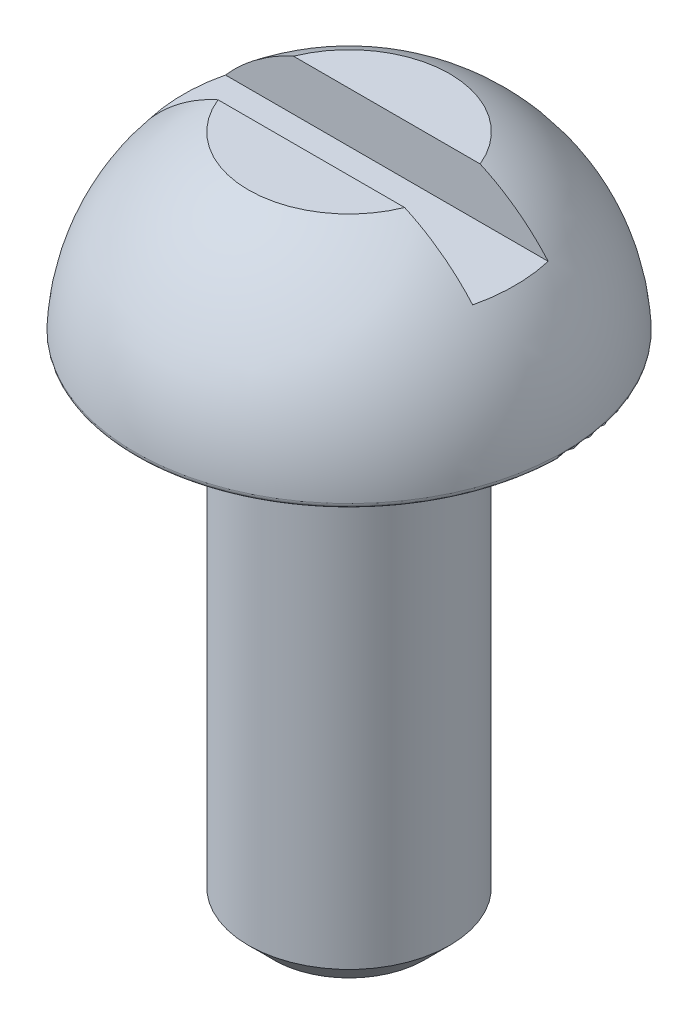
ISO-10303-21;
HEADER;
FILE_DESCRIPTION(('STEP AP214'),'2;1');
FILE_NAME('part.step','',(''),(''),'','','');
FILE_SCHEMA(('AUTOMOTIVE_DESIGN { 1 0 10303 214 1 1 1 1 }'));
ENDSEC;
DATA;
#1=APPLICATION_CONTEXT('core data for automotive mechanical design processes');
#2=APPLICATION_PROTOCOL_DEFINITION('international standard','automotive_design',2000,#1);
#3=PRODUCT_CONTEXT('',#1,'mechanical');
#4=PRODUCT('Part','Part','',(#3));
#5=PRODUCT_RELATED_PRODUCT_CATEGORY('part','',(#4));
#6=PRODUCT_DEFINITION_FORMATION('','',#4);
#7=PRODUCT_DEFINITION_CONTEXT('part definition',#1,'design');
#8=PRODUCT_DEFINITION('design','',#6,#7);
#9=PRODUCT_DEFINITION_SHAPE('','',#8);
#10=(LENGTH_UNIT() NAMED_UNIT(*) SI_UNIT(.MILLI.,.METRE.));
#11=(NAMED_UNIT(*) PLANE_ANGLE_UNIT() SI_UNIT($,.RADIAN.));
#12=(NAMED_UNIT(*) SI_UNIT($,.STERADIAN.) SOLID_ANGLE_UNIT());
#13=UNCERTAINTY_MEASURE_WITH_UNIT(LENGTH_MEASURE(1.E-05),#10,'distance_accuracy_value','');
#14=(GEOMETRIC_REPRESENTATION_CONTEXT(3) GLOBAL_UNCERTAINTY_ASSIGNED_CONTEXT((#13)) GLOBAL_UNIT_ASSIGNED_CONTEXT((#10,
#11,#12)) REPRESENTATION_CONTEXT('',''));
#15=CARTESIAN_POINT('',(0.,0.,0.));
#16=DIRECTION('',(0.,0.,1.));
#17=DIRECTION('',(1.,0.,0.));
#18=AXIS2_PLACEMENT_3D('',#15,#16,#17);
#19=CARTESIAN_POINT('',(0.,13.5,0.));
#20=DIRECTION('',(0.,1.,0.));
#21=DIRECTION('',(0.,0.,1.));
#22=AXIS2_PLACEMENT_3D('',#19,#20,#21);
#23=PLANE('',#22);
#24=DIRECTION('',(-1.,0.,0.));
#25=VECTOR('',#24,1.);
#26=CARTESIAN_POINT('',(-4.,13.5,-0.75));
#27=LINE('',#26,#25);
#28=CARTESIAN_POINT('',(1.85404962177392,13.5,-0.75));
#29=VERTEX_POINT('',#28);
#30=CARTESIAN_POINT('',(-1.85404962177392,13.5,-0.75));
#31=VERTEX_POINT('',#30);
#32=EDGE_CURVE('E83',#29,#31,#27,.T.);
#33=ORIENTED_EDGE('',*,*,#32,.F.);
#34=CARTESIAN_POINT('',(0.,13.5,0.));
#35=DIRECTION('',(0.,-1.,0.));
#36=DIRECTION('',(0.,0.,-1.));
#37=AXIS2_PLACEMENT_3D('',#34,#35,#36);
#38=CIRCLE('',#37,2.);
#39=EDGE_CURVE('E90',#31,#29,#38,.T.);
#40=ORIENTED_EDGE('',*,*,#39,.F.);
#41=EDGE_LOOP('',(#33,#40));
#42=FACE_BOUND('',#41,.T.);
#43=ADVANCED_FACE('F29',(#42),#23,.T.);
#44=CARTESIAN_POINT('',(1.5,0.,0.));
#45=DIRECTION('',(0.,-1.,0.));
#46=DIRECTION('',(0.,0.,-1.));
#47=AXIS2_PLACEMENT_3D('',#44,#45,#46);
#48=PLANE('',#47);
#49=CARTESIAN_POINT('',(0.,0.,0.));
#50=DIRECTION('',(0.,-1.,0.));
#51=DIRECTION('',(0.,0.,-1.));
#52=AXIS2_PLACEMENT_3D('',#49,#50,#51);
#53=CIRCLE('',#52,1.5);
#54=CARTESIAN_POINT('',(0.,0.,-1.5));
#55=VERTEX_POINT('',#54);
#56=EDGE_CURVE('E188',#55,#55,#53,.T.);
#57=ORIENTED_EDGE('',*,*,#56,.T.);
#58=EDGE_LOOP('',(#57));
#59=FACE_BOUND('',#58,.T.);
#60=ADVANCED_FACE('F31',(#59),#48,.T.);
#61=DIRECTION('',(1.,0.,0.));
#62=VECTOR('',#61,1.);
#63=CARTESIAN_POINT('',(-4.,13.5,0.750000000000001));
#64=LINE('',#63,#62);
#65=CARTESIAN_POINT('',(-1.85404962177392,13.5,0.75));
#66=VERTEX_POINT('',#65);
#67=CARTESIAN_POINT('',(1.85404962177392,13.5,0.75));
#68=VERTEX_POINT('',#67);
#69=EDGE_CURVE('E74',#66,#68,#64,.T.);
#70=ORIENTED_EDGE('',*,*,#69,.F.);
#71=EDGE_CURVE('E82',#68,#66,#38,.T.);
#72=ORIENTED_EDGE('',*,*,#71,.F.);
#73=EDGE_LOOP('',(#70,#72));
#74=FACE_BOUND('',#73,.T.);
#75=ADVANCED_FACE('F81',(#74),#23,.T.);
#76=CARTESIAN_POINT('',(0.,9.90254895572012,0.));
#77=DIRECTION('',(0.,-1.,0.));
#78=DIRECTION('',(0.,0.,-1.));
#79=AXIS2_PLACEMENT_3D('',#76,#77,#78);
#80=DEGENERATE_TOROIDAL_SURFACE('',#79,0.251187264453516,4.,.T.);
#81=CARTESIAN_POINT('',(0.,13.8713253231735,-0.75));
#82=CARTESIAN_POINT('',(-0.0629220390886012,13.8713254213378,-0.75));
#83=CARTESIAN_POINT('',(-0.125844467781649,13.8703374468603,-0.75));
#84=CARTESIAN_POINT('',(-0.251619483946908,13.8662956578809,-0.75));
#85=CARTESIAN_POINT('',(-0.314472072160981,13.8632418655369,-0.75));
#86=CARTESIAN_POINT('',(-0.502918858461382,13.8506387891646,-0.75));
#87=CARTESIAN_POINT('',(-0.628314596643319,13.8376472734626,-0.75));
#88=CARTESIAN_POINT('',(-0.869884431273301,13.8021927933833,-0.75));
#89=CARTESIAN_POINT('',(-0.986150684308808,13.7803627004585,-0.75));
#90=CARTESIAN_POINT('',(-1.21645990898877,13.7269196245079,-0.75));
#91=CARTESIAN_POINT('',(-1.33050229164678,13.6953040862557,-0.75));
#92=CARTESIAN_POINT('',(-1.55547287393435,13.6222320704912,-0.75));
#93=CARTESIAN_POINT('',(-1.6663990913075,13.5807694807947,-0.75));
#94=CARTESIAN_POINT('',(-1.88419647938333,13.4881868164881,-0.75));
#95=CARTESIAN_POINT('',(-1.99106618245551,13.4370632858373,-0.75));
#96=CARTESIAN_POINT('',(-2.19763665776107,13.3266772445949,-0.75));
#97=CARTESIAN_POINT('',(-2.29744086526932,13.2676082643384,-0.75));
#98=CARTESIAN_POINT('',(-2.49153541034022,13.1409398253045,-0.75));
#99=CARTESIAN_POINT('',(-2.58582359240153,13.0733370639324,-0.75));
#100=CARTESIAN_POINT('',(-2.7680690910925,12.9301403902095,-0.75));
#101=CARTESIAN_POINT('',(-2.85602908815232,12.8545498951203,-0.75));
#102=CARTESIAN_POINT('',(-3.02498268485799,12.695931842077,-0.75));
#103=CARTESIAN_POINT('',(-3.10597371602768,12.6129015649429,-0.75));
#104=CARTESIAN_POINT('',(-3.33143210845437,12.3603614140614,-0.75));
#105=CARTESIAN_POINT('',(-3.46574464429,12.1815688741806,-0.75));
#106=CARTESIAN_POINT('',(-3.70218252479334,11.8040090139898,-0.75));
#107=CARTESIAN_POINT('',(-3.80431386039929,11.6052454206421,-0.75));
#108=CARTESIAN_POINT('',(-3.97319355372104,11.1942557231494,-0.75));
#109=CARTESIAN_POINT('',(-4.0401021375461,10.9820955861659,-0.75));
#110=CARTESIAN_POINT('',(-4.13730574145651,10.5495442433007,-0.75));
#111=CARTESIAN_POINT('',(-4.16759935711677,10.3291527220255,-0.75));
#112=CARTESIAN_POINT('',(-4.19069515207767,9.88665882197309,-0.75));
#113=CARTESIAN_POINT('',(-4.18353898974582,9.66455861850789,-0.75));
#114=CARTESIAN_POINT('',(-4.13203662682793,9.22471647603451,-0.75));
#115=CARTESIAN_POINT('',(-4.08769068622574,9.00697450656997,-0.75));
#116=CARTESIAN_POINT('',(-3.96307377974643,8.58204274703518,-0.75));
#117=CARTESIAN_POINT('',(-3.88280649605122,8.37485187782938,-0.75));
#118=CARTESIAN_POINT('',(-3.68867736949314,7.97690766882909,-0.75));
#119=CARTESIAN_POINT('',(-3.57481747195615,7.78615337802955,-0.75));
#120=CARTESIAN_POINT('',(-3.31657081872274,7.42627346359334,-0.75));
#121=CARTESIAN_POINT('',(-3.17216904612608,7.25715854554567,-0.75));
#122=CARTESIAN_POINT('',(-2.93601924886324,7.02351332143022,-0.75));
#123=CARTESIAN_POINT('',(-2.85398221458269,6.94892545603554,-0.75));
#124=CARTESIAN_POINT('',(-2.68394810384282,6.80690184949098,-0.75));
#125=CARTESIAN_POINT('',(-2.59595319203265,6.73946353333475,-0.75));
#126=CARTESIAN_POINT('',(-2.41433368923245,6.61199276166022,-0.75));
#127=CARTESIAN_POINT('',(-2.32069166082742,6.55198519673803,-0.75));
#128=CARTESIAN_POINT('',(-2.12874390081305,6.44004320274453,-0.75));
#129=CARTESIAN_POINT('',(-2.0304398290893,6.38810592805728,-0.75));
#130=CARTESIAN_POINT('',(-1.82995802317233,6.2926537500461,-0.75));
#131=CARTESIAN_POINT('',(-1.72778462116709,6.24912974206796,-0.75));
#132=CARTESIAN_POINT('',(-1.52023329889945,6.17066887724191,-0.75));
#133=CARTESIAN_POINT('',(-1.41485641920221,6.13572926477363,-0.75));
#134=CARTESIAN_POINT('',(-1.2005465350259,6.0741975045066,-0.75));
#135=CARTESIAN_POINT('',(-1.09158838507219,6.04769309162907,-0.75));
#136=CARTESIAN_POINT('',(-0.87194324868985,6.00338521032545,-0.75));
#137=CARTESIAN_POINT('',(-0.76125644537532,5.98558082668133,-0.75));
#138=CARTESIAN_POINT('',(-0.538546587546819,5.95806859383276,-0.75));
#139=CARTESIAN_POINT('',(-0.426520440227823,5.94838619402209,-0.75));
#140=CARTESIAN_POINT('',(-0.258194158556273,5.93914793915042,-0.75));
#141=CARTESIAN_POINT('',(-0.202019189981141,5.93694955766882,-0.75));
#142=CARTESIAN_POINT('',(-0.0896292807192961,5.9341765918778,-0.75));
#143=CARTESIAN_POINT('',(-0.0334143413581222,5.93360195602258,-0.75));
#144=CARTESIAN_POINT('',(0.0895703381347306,5.93407056708453,-0.75));
#145=CARTESIAN_POINT('',(0.156339023293249,5.9354380251739,-0.75));
#146=CARTESIAN_POINT('',(0.289786823027111,5.94053883249711,-0.75));
#147=CARTESIAN_POINT('',(0.356465939241011,5.94427213784326,-0.75));
#148=CARTESIAN_POINT('',(0.489601645075184,5.95436469770027,-0.75));
#149=CARTESIAN_POINT('',(0.556058317748404,5.96072282720604,-0.75));
#150=CARTESIAN_POINT('',(0.688634384673021,5.97628855319762,-0.75));
#151=CARTESIAN_POINT('',(0.754753776904648,5.98549616672698,-0.75));
#152=CARTESIAN_POINT('',(0.951981100661976,6.01757626217259,-0.75));
#153=CARTESIAN_POINT('',(1.08239697789367,6.04493679870434,-0.75));
#154=CARTESIAN_POINT('',(1.33999759950547,6.11213097122829,-0.75));
#155=CARTESIAN_POINT('',(1.46718176548068,6.15196682326141,-0.75));
#156=CARTESIAN_POINT('',(1.71387869519374,6.24285666478502,-0.75));
#157=CARTESIAN_POINT('',(1.83350374454184,6.29360539741071,-0.75));
#158=CARTESIAN_POINT('',(2.06724369377024,6.4065047804184,-0.75));
#159=CARTESIAN_POINT('',(2.18135873591225,6.46865513622527,-0.75));
#160=CARTESIAN_POINT('',(2.40313784057959,6.60394177082253,-0.75));
#161=CARTESIAN_POINT('',(2.51079154052084,6.67709507024297,-0.75));
#162=CARTESIAN_POINT('',(2.71834946723273,6.83359515066767,-0.75));
#163=CARTESIAN_POINT('',(2.81825469564505,6.91694061053436,-0.75));
#164=CARTESIAN_POINT('',(3.07844234976517,7.1567818148287,-0.75));
#165=CARTESIAN_POINT('',(3.23025767468538,7.32265641437973,-0.75));
#166=CARTESIAN_POINT('',(3.5033601946328,7.67750241905313,-0.75));
#167=CARTESIAN_POINT('',(3.62467695528908,7.86645118969516,-0.750000000000001));
#168=CARTESIAN_POINT('',(3.83263269671526,8.26047409624548,-0.750000000000001));
#169=CARTESIAN_POINT('',(3.91956385703199,8.46539383941384,-0.750000000000001));
#170=CARTESIAN_POINT('',(4.0577395883791,8.88697054825718,-0.750000000000001));
#171=CARTESIAN_POINT('',(4.10897748310089,9.10362970158661,-0.750000000000001));
#172=CARTESIAN_POINT('',(4.17422265872735,9.54210881083407,-0.750000000000001));
#173=CARTESIAN_POINT('',(4.18829264552823,9.76391943692915,-0.750000000000001));
#174=CARTESIAN_POINT('',(4.17897916787922,10.2067483244606,-0.750000000000001));
#175=CARTESIAN_POINT('',(4.15559659045676,10.4277666045386,-0.750000000000001));
#176=CARTESIAN_POINT('',(4.07206283828415,10.8626708282922,-0.750000000000001));
#177=CARTESIAN_POINT('',(4.01192268581079,11.0765588897966,-0.750000000000001));
#178=CARTESIAN_POINT('',(3.85659607902625,11.4911991468696,-0.750000000000001));
#179=CARTESIAN_POINT('',(3.76141172880569,11.6919521302301,-0.750000000000001));
#180=CARTESIAN_POINT('',(3.53871279537206,12.0746900669347,-0.750000000000001));
#181=CARTESIAN_POINT('',(3.41118817548029,12.2566691691665,-0.75));
#182=CARTESIAN_POINT('',(3.12731814091474,12.5967721515395,-0.75));
#183=CARTESIAN_POINT('',(2.97096759896837,12.7548917786782,-0.750000000000001));
#184=CARTESIAN_POINT('',(2.71830594289221,12.97080228372,-0.75));
#185=CARTESIAN_POINT('',(2.6309277740663,13.0393084942463,-0.75));
#186=CARTESIAN_POINT('',(2.45074238373382,13.168745130094,-0.75));
#187=CARTESIAN_POINT('',(2.35793712481219,13.2296782694367,-0.75));
#188=CARTESIAN_POINT('',(2.1675677834584,13.343557218428,-0.75));
#189=CARTESIAN_POINT('',(2.07000403410402,13.3965035860641,-0.75));
#190=CARTESIAN_POINT('',(1.87084215744287,13.4940753895157,-0.75));
#191=CARTESIAN_POINT('',(1.76924542615833,13.5387036747013,-0.75));
#192=CARTESIAN_POINT('',(1.56195371290642,13.6197215068276,-0.75));
#193=CARTESIAN_POINT('',(1.45623396355732,13.6560476303505,-0.75));
#194=CARTESIAN_POINT('',(1.24221239842266,13.719915488697,-0.75));
#195=CARTESIAN_POINT('',(1.13391134592798,13.7474597865035,-0.75));
#196=CARTESIAN_POINT('',(0.915531306850148,13.7938641658016,-0.75));
#197=CARTESIAN_POINT('',(0.805453199909168,13.8127284152648,-0.75));
#198=CARTESIAN_POINT('',(0.584239227879711,13.8422672663623,-0.75));
#199=CARTESIAN_POINT('',(0.473103559335943,13.8529433607682,-0.75));
#200=CARTESIAN_POINT('',(0.301534200611887,13.8639021013191,-0.75));
#201=CARTESIAN_POINT('',(0.241243654966937,13.8667061035804,-0.75));
#202=CARTESIAN_POINT('',(0.12063550406229,13.870417155203,-0.75));
#203=CARTESIAN_POINT('',(0.060317931042758,13.8713252290718,-0.75));
#204=CARTESIAN_POINT('',(0.,13.8713253231735,-0.75));
#205=B_SPLINE_CURVE_WITH_KNOTS('',3,(#81,#82,#83,#84,#85,#86,#87,#88,#89,#90,#91,#92,#93,#94,
#95,#96,#97,#98,#99,#100,#101,#102,#103,#104,#105,#106,#107,#108,#109,#110,#111,#112,#113,#114,
#115,#116,#117,#118,#119,#120,#121,#122,#123,#124,#125,#126,#127,#128,#129,#130,#131,#132,#133,
#134,#135,#136,#137,#138,#139,#140,#141,#142,#143,#144,#145,#146,#147,#148,#149,#150,#151,#152,
#153,#154,#155,#156,#157,#158,#159,#160,#161,#162,#163,#164,#165,#166,#167,#168,#169,#170,#171,
#172,#173,#174,#175,#176,#177,#178,#179,#180,#181,#182,#183,#184,#185,#186,#187,#188,#189,#190,
#191,#192,#193,#194,#195,#196,#197,#198,#199,#200,#201,#202,#203,#204),.UNSPECIFIED.,.T.,.F.,(4,
2,2,2,2,2,2,2,2,2,2,2,2,2,2,2,2,2,2,2,2,2,2,2,2,2,2,2,2,2,2,2,2,2,2,2,2,2,2,2,2,2,2,2,2,2,2,2,2,
2,2,2,2,2,2,2,2,2,2,2,2,4),(0.,0.188756294687437,0.377510564821113,0.755280997491542,
1.10977622931115,1.46436410697405,1.81917265954468,2.174108380069,2.52158816349091,
2.86920283711227,3.21666939393033,3.56426346905097,4.23165319589308,4.89891860617539,
5.56312185026573,6.2273505701151,6.89084057267821,7.5543259369976,8.21774330512855,
8.88112226273996,9.54482815347266,9.87713428134949,10.20932031517,10.5425905787883,
10.875743062033,11.2085329713489,11.541215913981,11.8772538585757,12.2132564453317,
12.550307969775,12.7189437464545,12.8875741697316,13.0878831385615,13.2881883916656,
13.488407882506,13.688628570937,14.087755045107,14.4869524579857,14.876172775606,
15.2653830386506,15.6552016901302,16.0449698656331,16.7160597555839,17.3864965532814,
18.051107440301,18.7158426072585,19.3794555826048,20.0430528411576,20.7064512082832,
21.3698097507646,22.0333744165032,22.6970572246923,23.0298308802171,23.3624849310183,
23.6951157305166,24.0276323766348,24.3626101283001,24.6974900267561,25.0322089548769,
25.3668668463163,25.5479090789648,25.7288534560345),.UNSPECIFIED.);
#206=CARTESIAN_POINT('',(-3.20655950030948,12.5,-0.75));
#207=VERTEX_POINT('',#206);
#208=EDGE_CURVE('E11',#31,#207,#205,.T.);
#209=ORIENTED_EDGE('',*,*,#208,.F.);
#210=ORIENTED_EDGE('',*,*,#39,.T.);
#211=CARTESIAN_POINT('',(3.20655950030948,12.5,-0.75));
#212=VERTEX_POINT('',#211);
#213=EDGE_CURVE('E33',#212,#29,#205,.T.);
#214=ORIENTED_EDGE('',*,*,#213,.F.);
#215=CARTESIAN_POINT('',(0.,12.5,0.));
#216=DIRECTION('',(0.,1.,0.));
#217=DIRECTION('',(0.,0.,1.));
#218=AXIS2_PLACEMENT_3D('',#215,#216,#217);
#219=CIRCLE('',#218,3.29310246257613);
#220=CARTESIAN_POINT('',(3.20655950030948,12.5,0.75));
#221=VERTEX_POINT('',#220);
#222=EDGE_CURVE('E102',#212,#221,#219,.F.);
#223=ORIENTED_EDGE('',*,*,#222,.T.);
#224=CARTESIAN_POINT('',(0.,13.8713253231735,0.75));
#225=CARTESIAN_POINT('',(0.0629220390886012,13.8713254213378,0.75));
#226=CARTESIAN_POINT('',(0.125844467781649,13.8703374468603,0.75));
#227=CARTESIAN_POINT('',(0.251619483946908,13.8662956578809,0.75));
#228=CARTESIAN_POINT('',(0.314472072160981,13.8632418655369,0.75));
#229=CARTESIAN_POINT('',(0.502918858461382,13.8506387891646,0.75));
#230=CARTESIAN_POINT('',(0.628314596643319,13.8376472734626,0.75));
#231=CARTESIAN_POINT('',(0.869884431273301,13.8021927933833,0.75));
#232=CARTESIAN_POINT('',(0.986150684308808,13.7803627004585,0.75));
#233=CARTESIAN_POINT('',(1.21645990898877,13.7269196245079,0.75));
#234=CARTESIAN_POINT('',(1.33050229164678,13.6953040862557,0.75));
#235=CARTESIAN_POINT('',(1.55547287393435,13.6222320704912,0.75));
#236=CARTESIAN_POINT('',(1.6663990913075,13.5807694807947,0.75));
#237=CARTESIAN_POINT('',(1.88419647938333,13.4881868164881,0.75));
#238=CARTESIAN_POINT('',(1.99106618245551,13.4370632858373,0.75));
#239=CARTESIAN_POINT('',(2.19763665776107,13.3266772445949,0.75));
#240=CARTESIAN_POINT('',(2.29744086526932,13.2676082643384,0.75));
#241=CARTESIAN_POINT('',(2.49153541034022,13.1409398253045,0.75));
#242=CARTESIAN_POINT('',(2.58582359240153,13.0733370639324,0.75));
#243=CARTESIAN_POINT('',(2.7680690910925,12.9301403902095,0.75));
#244=CARTESIAN_POINT('',(2.85602908815232,12.8545498951203,0.75));
#245=CARTESIAN_POINT('',(3.02498268485799,12.695931842077,0.75));
#246=CARTESIAN_POINT('',(3.10597371602768,12.6129015649429,0.75));
#247=CARTESIAN_POINT('',(3.33143210845437,12.3603614140614,0.75));
#248=CARTESIAN_POINT('',(3.46574464429,12.1815688741806,0.75));
#249=CARTESIAN_POINT('',(3.70218252479334,11.8040090139898,0.75));
#250=CARTESIAN_POINT('',(3.80431386039929,11.6052454206421,0.749999999999999));
#251=CARTESIAN_POINT('',(3.97319355372104,11.1942557231494,0.749999999999999));
#252=CARTESIAN_POINT('',(4.0401021375461,10.9820955861659,0.749999999999999));
#253=CARTESIAN_POINT('',(4.13730574145651,10.5495442433007,0.749999999999999));
#254=CARTESIAN_POINT('',(4.16759935711677,10.3291527220255,0.749999999999999));
#255=CARTESIAN_POINT('',(4.19069515207767,9.88665882197309,0.749999999999999));
#256=CARTESIAN_POINT('',(4.18353898974582,9.66455861850789,0.749999999999999));
#257=CARTESIAN_POINT('',(4.13203662682793,9.22471647603451,0.749999999999999));
#258=CARTESIAN_POINT('',(4.08769068622574,9.00697450656997,0.749999999999999));
#259=CARTESIAN_POINT('',(3.96307377974643,8.58204274703518,0.749999999999999));
#260=CARTESIAN_POINT('',(3.88280649605122,8.37485187782938,0.749999999999999));
#261=CARTESIAN_POINT('',(3.68867736949314,7.97690766882909,0.749999999999999));
#262=CARTESIAN_POINT('',(3.57481747195615,7.78615337802955,0.75));
#263=CARTESIAN_POINT('',(3.31657081872274,7.42627346359334,0.75));
#264=CARTESIAN_POINT('',(3.17216904612608,7.25715854554567,0.749999999999999));
#265=CARTESIAN_POINT('',(2.93601924886324,7.02351332143022,0.75));
#266=CARTESIAN_POINT('',(2.85398221458269,6.94892545603554,0.75));
#267=CARTESIAN_POINT('',(2.68394810384282,6.80690184949098,0.75));
#268=CARTESIAN_POINT('',(2.59595319203265,6.73946353333475,0.75));
#269=CARTESIAN_POINT('',(2.41433368923245,6.61199276166022,0.75));
#270=CARTESIAN_POINT('',(2.32069166082742,6.55198519673803,0.75));
#271=CARTESIAN_POINT('',(2.12874390081305,6.44004320274453,0.75));
#272=CARTESIAN_POINT('',(2.0304398290893,6.38810592805728,0.75));
#273=CARTESIAN_POINT('',(1.82995802317233,6.2926537500461,0.75));
#274=CARTESIAN_POINT('',(1.72778462116709,6.24912974206796,0.75));
#275=CARTESIAN_POINT('',(1.52023329889945,6.17066887724191,0.75));
#276=CARTESIAN_POINT('',(1.41485641920221,6.13572926477363,0.75));
#277=CARTESIAN_POINT('',(1.2005465350259,6.0741975045066,0.75));
#278=CARTESIAN_POINT('',(1.09158838507219,6.04769309162907,0.75));
#279=CARTESIAN_POINT('',(0.87194324868985,6.00338521032545,0.75));
#280=CARTESIAN_POINT('',(0.76125644537532,5.98558082668133,0.75));
#281=CARTESIAN_POINT('',(0.538546587546819,5.95806859383276,0.75));
#282=CARTESIAN_POINT('',(0.426520440227823,5.94838619402209,0.75));
#283=CARTESIAN_POINT('',(0.258194158556273,5.93914793915042,0.75));
#284=CARTESIAN_POINT('',(0.202019189981141,5.93694955766882,0.75));
#285=CARTESIAN_POINT('',(0.0896292807192961,5.9341765918778,0.75));
#286=CARTESIAN_POINT('',(0.0334143413581222,5.93360195602258,0.75));
#287=CARTESIAN_POINT('',(-0.0895703381347306,5.93407056708453,0.75));
#288=CARTESIAN_POINT('',(-0.156339023293249,5.9354380251739,0.75));
#289=CARTESIAN_POINT('',(-0.289786823027111,5.94053883249711,0.75));
#290=CARTESIAN_POINT('',(-0.356465939241011,5.94427213784326,0.75));
#291=CARTESIAN_POINT('',(-0.489601645075184,5.95436469770027,0.75));
#292=CARTESIAN_POINT('',(-0.556058317748404,5.96072282720604,0.75));
#293=CARTESIAN_POINT('',(-0.688634384673021,5.97628855319762,0.75));
#294=CARTESIAN_POINT('',(-0.754753776904648,5.98549616672698,0.75));
#295=CARTESIAN_POINT('',(-0.951981100661976,6.01757626217259,0.75));
#296=CARTESIAN_POINT('',(-1.08239697789367,6.04493679870434,0.75));
#297=CARTESIAN_POINT('',(-1.33999759950547,6.11213097122829,0.75));
#298=CARTESIAN_POINT('',(-1.46718176548068,6.15196682326141,0.75));
#299=CARTESIAN_POINT('',(-1.71387869519374,6.24285666478502,0.75));
#300=CARTESIAN_POINT('',(-1.83350374454184,6.29360539741071,0.75));
#301=CARTESIAN_POINT('',(-2.06724369377024,6.4065047804184,0.75));
#302=CARTESIAN_POINT('',(-2.18135873591225,6.46865513622527,0.75));
#303=CARTESIAN_POINT('',(-2.40313784057959,6.60394177082253,0.75));
#304=CARTESIAN_POINT('',(-2.51079154052084,6.67709507024297,0.75));
#305=CARTESIAN_POINT('',(-2.71834946723273,6.83359515066767,0.75));
#306=CARTESIAN_POINT('',(-2.81825469564505,6.91694061053436,0.75));
#307=CARTESIAN_POINT('',(-3.07844234976517,7.1567818148287,0.75));
#308=CARTESIAN_POINT('',(-3.23025767468538,7.32265641437973,0.75));
#309=CARTESIAN_POINT('',(-3.5033601946328,7.67750241905313,0.75));
#310=CARTESIAN_POINT('',(-3.62467695528908,7.86645118969516,0.750000000000001));
#311=CARTESIAN_POINT('',(-3.83263269671526,8.26047409624548,0.750000000000001));
#312=CARTESIAN_POINT('',(-3.91956385703199,8.46539383941384,0.750000000000001));
#313=CARTESIAN_POINT('',(-4.0577395883791,8.88697054825718,0.750000000000001));
#314=CARTESIAN_POINT('',(-4.10897748310089,9.10362970158661,0.750000000000001));
#315=CARTESIAN_POINT('',(-4.17422265872735,9.54210881083407,0.750000000000001));
#316=CARTESIAN_POINT('',(-4.18829264552823,9.76391943692915,0.750000000000001));
#317=CARTESIAN_POINT('',(-4.17897916787922,10.2067483244606,0.750000000000001));
#318=CARTESIAN_POINT('',(-4.15559659045676,10.4277666045386,0.750000000000001));
#319=CARTESIAN_POINT('',(-4.07206283828415,10.8626708282922,0.750000000000001));
#320=CARTESIAN_POINT('',(-4.01192268581079,11.0765588897966,0.750000000000001));
#321=CARTESIAN_POINT('',(-3.85659607902625,11.4911991468696,0.750000000000001));
#322=CARTESIAN_POINT('',(-3.76141172880569,11.6919521302301,0.750000000000001));
#323=CARTESIAN_POINT('',(-3.53871279537206,12.0746900669347,0.750000000000001));
#324=CARTESIAN_POINT('',(-3.41118817548029,12.2566691691665,0.75));
#325=CARTESIAN_POINT('',(-3.12731814091474,12.5967721515395,0.75));
#326=CARTESIAN_POINT('',(-2.97096759896837,12.7548917786782,0.750000000000001));
#327=CARTESIAN_POINT('',(-2.71830594289221,12.97080228372,0.75));
#328=CARTESIAN_POINT('',(-2.6309277740663,13.0393084942463,0.75));
#329=CARTESIAN_POINT('',(-2.45074238373382,13.168745130094,0.75));
#330=CARTESIAN_POINT('',(-2.35793712481219,13.2296782694367,0.75));
#331=CARTESIAN_POINT('',(-2.1675677834584,13.343557218428,0.75));
#332=CARTESIAN_POINT('',(-2.07000403410402,13.3965035860641,0.75));
#333=CARTESIAN_POINT('',(-1.87084215744287,13.4940753895157,0.75));
#334=CARTESIAN_POINT('',(-1.76924542615833,13.5387036747013,0.75));
#335=CARTESIAN_POINT('',(-1.56195371290642,13.6197215068276,0.75));
#336=CARTESIAN_POINT('',(-1.45623396355732,13.6560476303505,0.75));
#337=CARTESIAN_POINT('',(-1.24221239842266,13.719915488697,0.75));
#338=CARTESIAN_POINT('',(-1.13391134592798,13.7474597865035,0.75));
#339=CARTESIAN_POINT('',(-0.915531306850148,13.7938641658016,0.75));
#340=CARTESIAN_POINT('',(-0.805453199909168,13.8127284152648,0.75));
#341=CARTESIAN_POINT('',(-0.584239227879711,13.8422672663623,0.75));
#342=CARTESIAN_POINT('',(-0.473103559335943,13.8529433607682,0.75));
#343=CARTESIAN_POINT('',(-0.301534200611887,13.8639021013191,0.75));
#344=CARTESIAN_POINT('',(-0.241243654966937,13.8667061035804,0.75));
#345=CARTESIAN_POINT('',(-0.12063550406229,13.870417155203,0.75));
#346=CARTESIAN_POINT('',(-0.060317931042758,13.8713252290718,0.75));
#347=CARTESIAN_POINT('',(0.,13.8713253231735,0.75));
#348=B_SPLINE_CURVE_WITH_KNOTS('',3,(#224,#225,#226,#227,#228,#229,#230,#231,#232,#233,#234,
#235,#236,#237,#238,#239,#240,#241,#242,#243,#244,#245,#246,#247,#248,#249,#250,#251,#252,#253,
#254,#255,#256,#257,#258,#259,#260,#261,#262,#263,#264,#265,#266,#267,#268,#269,#270,#271,#272,
#273,#274,#275,#276,#277,#278,#279,#280,#281,#282,#283,#284,#285,#286,#287,#288,#289,#290,#291,
#292,#293,#294,#295,#296,#297,#298,#299,#300,#301,#302,#303,#304,#305,#306,#307,#308,#309,#310,
#311,#312,#313,#314,#315,#316,#317,#318,#319,#320,#321,#322,#323,#324,#325,#326,#327,#328,#329,
#330,#331,#332,#333,#334,#335,#336,#337,#338,#339,#340,#341,#342,#343,#344,#345,#346,#347),
.UNSPECIFIED.,.T.,.F.,(4,2,2,2,2,2,2,2,2,2,2,2,2,2,2,2,2,2,2,2,2,2,2,2,2,2,2,2,2,2,2,2,2,2,2,2,
2,2,2,2,2,2,2,2,2,2,2,2,2,2,2,2,2,2,2,2,2,2,2,2,2,4),(0.,0.188756294687437,0.377510564821113,
0.755280997491542,1.10977622931115,1.46436410697405,1.81917265954468,2.174108380069,
2.52158816349091,2.86920283711227,3.21666939393033,3.56426346905097,4.23165319589308,
4.89891860617539,5.56312185026573,6.2273505701151,6.89084057267821,7.5543259369976,
8.21774330512855,8.88112226273996,9.54482815347266,9.87713428134949,10.20932031517,
10.5425905787883,10.875743062033,11.2085329713489,11.541215913981,11.8772538585757,
12.2132564453317,12.550307969775,12.7189437464545,12.8875741697316,13.0878831385615,
13.2881883916656,13.488407882506,13.688628570937,14.087755045107,14.4869524579857,
14.876172775606,15.2653830386506,15.6552016901302,16.0449698656331,16.7160597555839,
17.3864965532814,18.051107440301,18.7158426072585,19.3794555826048,20.0430528411576,
20.7064512082832,21.3698097507646,22.0333744165032,22.6970572246923,23.0298308802171,
23.3624849310183,23.6951157305166,24.0276323766348,24.3626101283001,24.6974900267561,
25.0322089548769,25.3668668463163,25.5479090789648,25.7288534560345),.UNSPECIFIED.);
#349=EDGE_CURVE('E78',#68,#221,#348,.T.);
#350=ORIENTED_EDGE('',*,*,#349,.F.);
#351=ORIENTED_EDGE('',*,*,#71,.T.);
#352=CARTESIAN_POINT('',(-3.20655950030948,12.5,0.75));
#353=VERTEX_POINT('',#352);
#354=EDGE_CURVE('E42',#353,#66,#348,.T.);
#355=ORIENTED_EDGE('',*,*,#354,.F.);
#356=EDGE_CURVE('E54',#353,#207,#219,.F.);
#357=ORIENTED_EDGE('',*,*,#356,.T.);
#358=EDGE_LOOP('',(#209,#210,#214,#223,#350,#351,#355,#357));
#359=FACE_BOUND('',#358,.T.);
#360=CARTESIAN_POINT('',(0.,10.1050628472892,0.));
#361=DIRECTION('',(0.,-1.,0.));
#362=DIRECTION('',(0.,0.,-1.));
#363=AXIS2_PLACEMENT_3D('',#360,#361,#362);
#364=CIRCLE('',#363,4.24605749059623);
#365=CARTESIAN_POINT('',(0.,10.1050628472892,-4.24605749059623));
#366=VERTEX_POINT('',#365);
#367=EDGE_CURVE('E93',#366,#366,#364,.F.);
#368=ORIENTED_EDGE('',*,*,#367,.T.);
#369=EDGE_LOOP('',(#368));
#370=FACE_BOUND('',#369,.T.);
#371=ADVANCED_FACE('F86',(#359,#370),#80,.T.);
#372=CARTESIAN_POINT('',(4.25,10.,0.));
#373=DIRECTION('',(0.,-1.,0.));
#374=DIRECTION('',(0.,0.,-1.));
#375=AXIS2_PLACEMENT_3D('',#372,#373,#374);
#376=PLANE('',#375);
#377=CARTESIAN_POINT('',(0.,10.,0.));
#378=DIRECTION('',(0.,-1.,0.));
#379=DIRECTION('',(0.,0.,-1.));
#380=AXIS2_PLACEMENT_3D('',#377,#378,#379);
#381=CIRCLE('',#380,4.14618573494266);
#382=CARTESIAN_POINT('',(0.,10.,-4.14618573494266));
#383=VERTEX_POINT('',#382);
#384=EDGE_CURVE('E89',#383,#383,#381,.T.);
#385=ORIENTED_EDGE('',*,*,#384,.T.);
#386=EDGE_LOOP('',(#385));
#387=FACE_BOUND('',#386,.T.);
#388=CARTESIAN_POINT('',(0.,10.,0.));
#389=DIRECTION('',(0.,-1.,0.));
#390=DIRECTION('',(0.,0.,-1.));
#391=AXIS2_PLACEMENT_3D('',#388,#389,#390);
#392=CIRCLE('',#391,2.);
#393=CARTESIAN_POINT('',(0.,10.,-2.));
#394=VERTEX_POINT('',#393);
#395=EDGE_CURVE('E96',#394,#394,#392,.T.);
#396=ORIENTED_EDGE('',*,*,#395,.F.);
#397=EDGE_LOOP('',(#396));
#398=FACE_BOUND('',#397,.T.);
#399=ADVANCED_FACE('F125',(#387,#398),#376,.T.);
#400=CARTESIAN_POINT('',(0.,0.,0.));
#401=DIRECTION('',(0.,-1.,0.));
#402=DIRECTION('',(0.,0.,-1.));
#403=AXIS2_PLACEMENT_3D('',#400,#401,#402);
#404=CYLINDRICAL_SURFACE('',#403,2.);
#405=ORIENTED_EDGE('',*,*,#395,.T.);
#406=EDGE_LOOP('',(#405));
#407=FACE_BOUND('',#406,.T.);
#408=CARTESIAN_POINT('',(0.,0.500000000000003,0.));
#409=DIRECTION('',(0.,-1.,0.));
#410=DIRECTION('',(0.,0.,-1.));
#411=AXIS2_PLACEMENT_3D('',#408,#409,#410);
#412=CIRCLE('',#411,2.);
#413=CARTESIAN_POINT('',(0.,0.500000000000003,-2.));
#414=VERTEX_POINT('',#413);
#415=EDGE_CURVE('E194',#414,#414,#412,.T.);
#416=ORIENTED_EDGE('',*,*,#415,.F.);
#417=EDGE_LOOP('',(#416));
#418=FACE_BOUND('',#417,.T.);
#419=ADVANCED_FACE('F122',(#407,#418),#404,.T.);
#420=CARTESIAN_POINT('',(0.,0.,0.));
#421=DIRECTION('',(0.,1.,0.));
#422=DIRECTION('',(0.,0.,1.));
#423=AXIS2_PLACEMENT_3D('',#420,#421,#422);
#424=CONICAL_SURFACE('',#423,1.5,0.785398163397445);
#425=ORIENTED_EDGE('',*,*,#415,.T.);
#426=EDGE_LOOP('',(#425));
#427=FACE_BOUND('',#426,.T.);
#428=ORIENTED_EDGE('',*,*,#56,.F.);
#429=EDGE_LOOP('',(#428));
#430=FACE_BOUND('',#429,.T.);
#431=ADVANCED_FACE('F118',(#427,#430),#424,.T.);
#432=CARTESIAN_POINT('',(0.,10.1,0.));
#433=DIRECTION('',(0.,-1.,0.));
#434=DIRECTION('',(0.,0.,-1.));
#435=AXIS2_PLACEMENT_3D('',#432,#433,#434);
#436=TOROIDAL_SURFACE('',#435,4.14618573494266,0.1);
#437=ORIENTED_EDGE('',*,*,#367,.F.);
#438=EDGE_LOOP('',(#437));
#439=FACE_BOUND('',#438,.T.);
#440=ORIENTED_EDGE('',*,*,#384,.F.);
#441=EDGE_LOOP('',(#440));
#442=FACE_BOUND('',#441,.T.);
#443=ADVANCED_FACE('F115',(#439,#442),#436,.T.);
#444=CARTESIAN_POINT('',(-4.,12.5,-0.75));
#445=DIRECTION('',(0.,0.,-1.));
#446=DIRECTION('',(-1.,0.,0.));
#447=AXIS2_PLACEMENT_3D('',#444,#445,#446);
#448=PLANE('',#447);
#449=ORIENTED_EDGE('',*,*,#208,.T.);
#450=DIRECTION('',(-1.,0.,0.));
#451=VECTOR('',#450,1.);
#452=CARTESIAN_POINT('',(-4.,12.5,-0.75));
#453=LINE('',#452,#451);
#454=EDGE_CURVE('E185',#212,#207,#453,.T.);
#455=ORIENTED_EDGE('',*,*,#454,.F.);
#456=ORIENTED_EDGE('',*,*,#213,.T.);
#457=ORIENTED_EDGE('',*,*,#32,.T.);
#458=EDGE_LOOP('',(#449,#455,#456,#457));
#459=FACE_BOUND('',#458,.T.);
#460=ADVANCED_FACE('F112',(#459),#448,.F.);
#461=CARTESIAN_POINT('',(-4.,12.5,0.750000000000001));
#462=DIRECTION('',(0.,0.,1.));
#463=DIRECTION('',(1.,0.,0.));
#464=AXIS2_PLACEMENT_3D('',#461,#462,#463);
#465=PLANE('',#464);
#466=ORIENTED_EDGE('',*,*,#349,.T.);
#467=DIRECTION('',(1.,0.,0.));
#468=VECTOR('',#467,1.);
#469=CARTESIAN_POINT('',(-4.,12.5,0.750000000000001));
#470=LINE('',#469,#468);
#471=EDGE_CURVE('E49',#353,#221,#470,.T.);
#472=ORIENTED_EDGE('',*,*,#471,.F.);
#473=ORIENTED_EDGE('',*,*,#354,.T.);
#474=ORIENTED_EDGE('',*,*,#69,.T.);
#475=EDGE_LOOP('',(#466,#472,#473,#474));
#476=FACE_BOUND('',#475,.T.);
#477=ADVANCED_FACE('F73',(#476),#465,.F.);
#478=CARTESIAN_POINT('',(-4.,12.5,-0.75));
#479=DIRECTION('',(0.,1.,0.));
#480=DIRECTION('',(0.,0.,1.));
#481=AXIS2_PLACEMENT_3D('',#478,#479,#480);
#482=PLANE('',#481);
#483=ORIENTED_EDGE('',*,*,#471,.T.);
#484=ORIENTED_EDGE('',*,*,#222,.F.);
#485=ORIENTED_EDGE('',*,*,#454,.T.);
#486=ORIENTED_EDGE('',*,*,#356,.F.);
#487=EDGE_LOOP('',(#483,#484,#485,#486));
#488=FACE_BOUND('',#487,.T.);
#489=ADVANCED_FACE('F111',(#488),#482,.T.);
#490=CLOSED_SHELL('',(#43,#60,#75,#371,#399,#419,#431,#443,#460,#477,#489));
#491=MANIFOLD_SOLID_BREP('B2',#490);
#492=ADVANCED_BREP_SHAPE_REPRESENTATION('',(#18,#491),#14);
#493=SHAPE_DEFINITION_REPRESENTATION(#9,#492);
ENDSEC;
END-ISO-10303-21;
